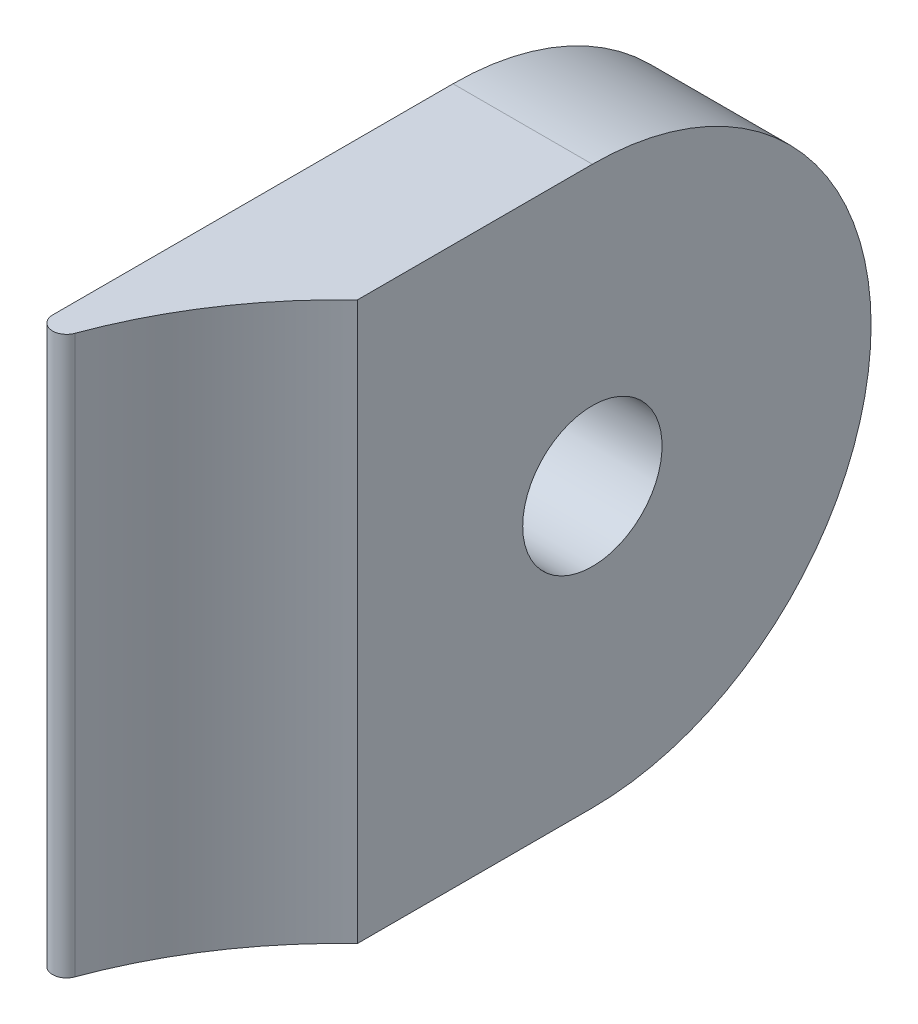
ISO-10303-21;
HEADER;
FILE_DESCRIPTION(('STEP AP214'),'2;1');
FILE_NAME('part.step','',(''),(''),'','','');
FILE_SCHEMA(('AUTOMOTIVE_DESIGN { 1 0 10303 214 1 1 1 1 }'));
ENDSEC;
DATA;
#1=APPLICATION_CONTEXT('core data for automotive mechanical design processes');
#2=APPLICATION_PROTOCOL_DEFINITION('international standard','automotive_design',2000,#1);
#3=PRODUCT_CONTEXT('',#1,'mechanical');
#4=PRODUCT('Part','Part','',(#3));
#5=PRODUCT_RELATED_PRODUCT_CATEGORY('part','',(#4));
#6=PRODUCT_DEFINITION_FORMATION('','',#4);
#7=PRODUCT_DEFINITION_CONTEXT('part definition',#1,'design');
#8=PRODUCT_DEFINITION('design','',#6,#7);
#9=PRODUCT_DEFINITION_SHAPE('','',#8);
#10=(LENGTH_UNIT() NAMED_UNIT(*) SI_UNIT(.MILLI.,.METRE.));
#11=(NAMED_UNIT(*) PLANE_ANGLE_UNIT() SI_UNIT($,.RADIAN.));
#12=(NAMED_UNIT(*) SI_UNIT($,.STERADIAN.) SOLID_ANGLE_UNIT());
#13=UNCERTAINTY_MEASURE_WITH_UNIT(LENGTH_MEASURE(1.E-05),#10,'distance_accuracy_value','');
#14=(GEOMETRIC_REPRESENTATION_CONTEXT(3) GLOBAL_UNCERTAINTY_ASSIGNED_CONTEXT((#13)) GLOBAL_UNIT_ASSIGNED_CONTEXT((#10,
#11,#12)) REPRESENTATION_CONTEXT('',''));
#15=CARTESIAN_POINT('',(0.,0.,0.));
#16=DIRECTION('',(0.,0.,1.));
#17=DIRECTION('',(1.,0.,0.));
#18=AXIS2_PLACEMENT_3D('',#15,#16,#17);
#19=CARTESIAN_POINT('',(0.,20.,0.));
#20=DIRECTION('',(0.,-1.,0.));
#21=DIRECTION('',(0.,0.,-1.));
#22=AXIS2_PLACEMENT_3D('',#19,#20,#21);
#23=CYLINDRICAL_SURFACE('',#22,15.875);
#24=CARTESIAN_POINT('',(0.,20.,0.));
#25=DIRECTION('',(0.,-1.,0.));
#26=DIRECTION('',(0.,0.,1.));
#27=AXIS2_PLACEMENT_3D('',#24,#25,#26);
#28=CIRCLE('',#27,15.875);
#29=CARTESIAN_POINT('',(-14.905534351145,20.,-5.46266150395896));
#30=VERTEX_POINT('',#29);
#31=CARTESIAN_POINT('',(-10.875,20.,-11.5650335062204));
#32=VERTEX_POINT('',#31);
#33=EDGE_CURVE('E89',#30,#32,#28,.T.);
#34=ORIENTED_EDGE('',*,*,#33,.F.);
#35=DIRECTION('',(0.,-1.,0.));
#36=VECTOR('',#35,1.);
#37=CARTESIAN_POINT('',(-14.905534351145,20.,-5.46266150395896));
#38=LINE('',#37,#36);
#39=CARTESIAN_POINT('',(-14.905534351145,0.,-5.46266150395896));
#40=VERTEX_POINT('',#39);
#41=EDGE_CURVE('E129',#30,#40,#38,.T.);
#42=ORIENTED_EDGE('',*,*,#41,.T.);
#43=CARTESIAN_POINT('',(0.,0.,0.));
#44=DIRECTION('',(0.,-1.,0.));
#45=DIRECTION('',(0.,0.,1.));
#46=AXIS2_PLACEMENT_3D('',#43,#44,#45);
#47=CIRCLE('',#46,15.875);
#48=CARTESIAN_POINT('',(-10.875,0.,-11.5650335062204));
#49=VERTEX_POINT('',#48);
#50=EDGE_CURVE('E110',#40,#49,#47,.T.);
#51=ORIENTED_EDGE('',*,*,#50,.T.);
#52=DIRECTION('',(0.,-1.,0.));
#53=VECTOR('',#52,1.);
#54=CARTESIAN_POINT('',(-10.875,20.,-11.5650335062204));
#55=LINE('',#54,#53);
#56=EDGE_CURVE('E105',#32,#49,#55,.T.);
#57=ORIENTED_EDGE('',*,*,#56,.F.);
#58=EDGE_LOOP('',(#34,#42,#51,#57));
#59=FACE_BOUND('',#58,.T.);
#60=ADVANCED_FACE('F36',(#59),#23,.F.);
#61=CARTESIAN_POINT('',(-10.875,20.,-30.));
#62=DIRECTION('',(-1.,0.,0.));
#63=DIRECTION('',(0.,0.,1.));
#64=AXIS2_PLACEMENT_3D('',#61,#62,#63);
#65=PLANE('',#64);
#66=CARTESIAN_POINT('',(-10.875,10.,-20.));
#67=DIRECTION('',(-1.,0.,0.));
#68=DIRECTION('',(0.,0.,1.));
#69=AXIS2_PLACEMENT_3D('',#66,#67,#68);
#70=CIRCLE('',#69,2.5);
#71=CARTESIAN_POINT('',(-10.875,10.,-17.5));
#72=VERTEX_POINT('',#71);
#73=EDGE_CURVE('E133',#72,#72,#70,.T.);
#74=ORIENTED_EDGE('',*,*,#73,.T.);
#75=EDGE_LOOP('',(#74));
#76=FACE_BOUND('',#75,.T.);
#77=DIRECTION('',(0.,0.,-1.));
#78=VECTOR('',#77,1.);
#79=CARTESIAN_POINT('',(-10.875,0.,-30.));
#80=LINE('',#79,#78);
#81=CARTESIAN_POINT('',(-10.875,0.,-20.));
#82=VERTEX_POINT('',#81);
#83=EDGE_CURVE('E137',#49,#82,#80,.T.);
#84=ORIENTED_EDGE('',*,*,#83,.T.);
#85=CARTESIAN_POINT('',(-10.875,10.,-20.));
#86=DIRECTION('',(-1.,0.,0.));
#87=DIRECTION('',(0.,0.,1.));
#88=AXIS2_PLACEMENT_3D('',#85,#86,#87);
#89=CIRCLE('',#88,10.);
#90=CARTESIAN_POINT('',(-10.875,10.,-30.));
#91=VERTEX_POINT('',#90);
#92=EDGE_CURVE('E125',#82,#91,#89,.F.);
#93=ORIENTED_EDGE('',*,*,#92,.T.);
#94=CARTESIAN_POINT('',(-10.875,10.,-20.));
#95=DIRECTION('',(-1.,0.,0.));
#96=DIRECTION('',(0.,0.,1.));
#97=AXIS2_PLACEMENT_3D('',#94,#95,#96);
#98=CIRCLE('',#97,10.);
#99=CARTESIAN_POINT('',(-10.875,20.,-20.));
#100=VERTEX_POINT('',#99);
#101=EDGE_CURVE('E107',#91,#100,#98,.F.);
#102=ORIENTED_EDGE('',*,*,#101,.T.);
#103=DIRECTION('',(0.,0.,-1.));
#104=VECTOR('',#103,1.);
#105=CARTESIAN_POINT('',(-10.875,20.,-30.));
#106=LINE('',#105,#104);
#107=EDGE_CURVE('E92',#32,#100,#106,.T.);
#108=ORIENTED_EDGE('',*,*,#107,.F.);
#109=ORIENTED_EDGE('',*,*,#56,.T.);
#110=EDGE_LOOP('',(#84,#93,#102,#108,#109));
#111=FACE_BOUND('',#110,.T.);
#112=ADVANCED_FACE('F104',(#76,#111),#65,.F.);
#113=CARTESIAN_POINT('',(-15.875,20.,0.));
#114=DIRECTION('',(1.,0.,0.));
#115=DIRECTION('',(0.,0.,-1.));
#116=AXIS2_PLACEMENT_3D('',#113,#114,#115);
#117=PLANE('',#116);
#118=CARTESIAN_POINT('',(-15.875,10.,-20.));
#119=DIRECTION('',(-1.,0.,0.));
#120=DIRECTION('',(0.,0.,1.));
#121=AXIS2_PLACEMENT_3D('',#118,#119,#120);
#122=CIRCLE('',#121,2.5);
#123=CARTESIAN_POINT('',(-15.875,10.,-17.5));
#124=VERTEX_POINT('',#123);
#125=EDGE_CURVE('E140',#124,#124,#122,.T.);
#126=ORIENTED_EDGE('',*,*,#125,.F.);
#127=EDGE_LOOP('',(#126));
#128=FACE_BOUND('',#127,.T.);
#129=DIRECTION('',(0.,0.,1.));
#130=VECTOR('',#129,1.);
#131=CARTESIAN_POINT('',(-15.875,0.,0.));
#132=LINE('',#131,#130);
#133=CARTESIAN_POINT('',(-15.875,0.,-20.));
#134=VERTEX_POINT('',#133);
#135=CARTESIAN_POINT('',(-15.875,0.,-5.63471383479232));
#136=VERTEX_POINT('',#135);
#137=EDGE_CURVE('E99',#134,#136,#132,.T.);
#138=ORIENTED_EDGE('',*,*,#137,.T.);
#139=DIRECTION('',(0.,-1.,0.));
#140=VECTOR('',#139,1.);
#141=CARTESIAN_POINT('',(-15.875,20.,-5.63471383479232));
#142=LINE('',#141,#140);
#143=CARTESIAN_POINT('',(-15.875,20.,-5.63471383479232));
#144=VERTEX_POINT('',#143);
#145=EDGE_CURVE('E44',#136,#144,#142,.F.);
#146=ORIENTED_EDGE('',*,*,#145,.T.);
#147=DIRECTION('',(0.,0.,1.));
#148=VECTOR('',#147,1.);
#149=CARTESIAN_POINT('',(-15.875,20.,0.));
#150=LINE('',#149,#148);
#151=CARTESIAN_POINT('',(-15.875,20.,-20.));
#152=VERTEX_POINT('',#151);
#153=EDGE_CURVE('E108',#152,#144,#150,.T.);
#154=ORIENTED_EDGE('',*,*,#153,.F.);
#155=CARTESIAN_POINT('',(-15.875,10.,-20.));
#156=DIRECTION('',(1.,0.,0.));
#157=DIRECTION('',(0.,0.,-1.));
#158=AXIS2_PLACEMENT_3D('',#155,#156,#157);
#159=CIRCLE('',#158,10.);
#160=CARTESIAN_POINT('',(-15.875,10.,-30.));
#161=VERTEX_POINT('',#160);
#162=EDGE_CURVE('E112',#152,#161,#159,.F.);
#163=ORIENTED_EDGE('',*,*,#162,.T.);
#164=CARTESIAN_POINT('',(-15.875,10.,-20.));
#165=DIRECTION('',(1.,0.,0.));
#166=DIRECTION('',(0.,0.,-1.));
#167=AXIS2_PLACEMENT_3D('',#164,#165,#166);
#168=CIRCLE('',#167,10.);
#169=EDGE_CURVE('E114',#161,#134,#168,.F.);
#170=ORIENTED_EDGE('',*,*,#169,.T.);
#171=EDGE_LOOP('',(#138,#146,#154,#163,#170));
#172=FACE_BOUND('',#171,.T.);
#173=ADVANCED_FACE('F154',(#128,#172),#117,.F.);
#174=CARTESIAN_POINT('',(0.,20.,0.));
#175=DIRECTION('',(0.,1.,0.));
#176=DIRECTION('',(0.,0.,1.));
#177=AXIS2_PLACEMENT_3D('',#174,#175,#176);
#178=PLANE('',#177);
#179=ORIENTED_EDGE('',*,*,#153,.T.);
#180=CARTESIAN_POINT('',(-15.375,20.,-5.63471383479232));
#181=DIRECTION('',(0.,1.,0.));
#182=DIRECTION('',(0.,0.,1.));
#183=AXIS2_PLACEMENT_3D('',#180,#181,#182);
#184=CIRCLE('',#183,0.5);
#185=EDGE_CURVE('E11',#144,#30,#184,.T.);
#186=ORIENTED_EDGE('',*,*,#185,.T.);
#187=ORIENTED_EDGE('',*,*,#33,.T.);
#188=ORIENTED_EDGE('',*,*,#107,.T.);
#189=DIRECTION('',(-1.,0.,0.));
#190=VECTOR('',#189,1.);
#191=CARTESIAN_POINT('',(-15.875,20.,-20.));
#192=LINE('',#191,#190);
#193=EDGE_CURVE('E127',#100,#152,#192,.T.);
#194=ORIENTED_EDGE('',*,*,#193,.T.);
#195=EDGE_LOOP('',(#179,#186,#187,#188,#194));
#196=FACE_BOUND('',#195,.T.);
#197=ADVANCED_FACE('F91',(#196),#178,.T.);
#198=CARTESIAN_POINT('',(0.,0.,0.));
#199=DIRECTION('',(0.,1.,0.));
#200=DIRECTION('',(0.,0.,1.));
#201=AXIS2_PLACEMENT_3D('',#198,#199,#200);
#202=PLANE('',#201);
#203=ORIENTED_EDGE('',*,*,#50,.F.);
#204=CARTESIAN_POINT('',(-15.375,0.,-5.63471383479232));
#205=DIRECTION('',(0.,1.,0.));
#206=DIRECTION('',(0.,0.,1.));
#207=AXIS2_PLACEMENT_3D('',#204,#205,#206);
#208=CIRCLE('',#207,0.5);
#209=EDGE_CURVE('E58',#40,#136,#208,.F.);
#210=ORIENTED_EDGE('',*,*,#209,.T.);
#211=ORIENTED_EDGE('',*,*,#137,.F.);
#212=DIRECTION('',(-1.,0.,0.));
#213=VECTOR('',#212,1.);
#214=CARTESIAN_POINT('',(0.,0.,-20.));
#215=LINE('',#214,#213);
#216=EDGE_CURVE('E121',#134,#82,#215,.F.);
#217=ORIENTED_EDGE('',*,*,#216,.T.);
#218=ORIENTED_EDGE('',*,*,#83,.F.);
#219=EDGE_LOOP('',(#203,#210,#211,#217,#218));
#220=FACE_BOUND('',#219,.T.);
#221=ADVANCED_FACE('F136',(#220),#202,.F.);
#222=CARTESIAN_POINT('',(0.,10.,-20.));
#223=DIRECTION('',(1.,0.,0.));
#224=DIRECTION('',(0.,0.,-1.));
#225=AXIS2_PLACEMENT_3D('',#222,#223,#224);
#226=CYLINDRICAL_SURFACE('',#225,10.);
#227=ORIENTED_EDGE('',*,*,#193,.F.);
#228=ORIENTED_EDGE('',*,*,#101,.F.);
#229=DIRECTION('',(-1.,0.,0.));
#230=VECTOR('',#229,1.);
#231=CARTESIAN_POINT('',(-10.875,10.,-30.));
#232=LINE('',#231,#230);
#233=EDGE_CURVE('E130',#161,#91,#232,.F.);
#234=ORIENTED_EDGE('',*,*,#233,.F.);
#235=ORIENTED_EDGE('',*,*,#162,.F.);
#236=EDGE_LOOP('',(#227,#228,#234,#235));
#237=FACE_BOUND('',#236,.T.);
#238=ADVANCED_FACE('F170',(#237),#226,.T.);
#239=CARTESIAN_POINT('',(-15.875,10.,-20.));
#240=DIRECTION('',(-1.,0.,0.));
#241=DIRECTION('',(0.,0.,1.));
#242=AXIS2_PLACEMENT_3D('',#239,#240,#241);
#243=CYLINDRICAL_SURFACE('',#242,10.);
#244=ORIENTED_EDGE('',*,*,#92,.F.);
#245=ORIENTED_EDGE('',*,*,#216,.F.);
#246=ORIENTED_EDGE('',*,*,#169,.F.);
#247=ORIENTED_EDGE('',*,*,#233,.T.);
#248=EDGE_LOOP('',(#244,#245,#246,#247));
#249=FACE_BOUND('',#248,.T.);
#250=ADVANCED_FACE('F150',(#249),#243,.T.);
#251=CARTESIAN_POINT('',(-10.875,10.,-20.));
#252=DIRECTION('',(-1.,0.,0.));
#253=DIRECTION('',(0.,0.,1.));
#254=AXIS2_PLACEMENT_3D('',#251,#252,#253);
#255=CYLINDRICAL_SURFACE('',#254,2.5);
#256=CARTESIAN_POINT('',(-10.875,10.,-17.5));
#257=CARTESIAN_POINT('',(-10.9270833333333,10.,-17.5));
#258=CARTESIAN_POINT('',(-10.9791666666667,10.,-17.5));
#259=CARTESIAN_POINT('',(-11.0833333333333,10.,-17.5));
#260=CARTESIAN_POINT('',(-11.1354166666667,10.,-17.5));
#261=CARTESIAN_POINT('',(-11.2395833333333,10.,-17.5));
#262=CARTESIAN_POINT('',(-11.2916666666667,10.,-17.5));
#263=CARTESIAN_POINT('',(-11.3958333333333,10.,-17.5));
#264=CARTESIAN_POINT('',(-11.4479166666667,10.,-17.5));
#265=CARTESIAN_POINT('',(-11.5520833333333,10.,-17.5));
#266=CARTESIAN_POINT('',(-11.6041666666667,10.,-17.5));
#267=CARTESIAN_POINT('',(-11.7083333333333,10.,-17.5));
#268=CARTESIAN_POINT('',(-11.7604166666667,10.,-17.5));
#269=CARTESIAN_POINT('',(-11.8645833333333,10.,-17.5));
#270=CARTESIAN_POINT('',(-11.9166666666667,10.,-17.5));
#271=CARTESIAN_POINT('',(-12.0208333333333,10.,-17.5));
#272=CARTESIAN_POINT('',(-12.0729166666667,10.,-17.5));
#273=CARTESIAN_POINT('',(-12.1770833333333,10.,-17.5));
#274=CARTESIAN_POINT('',(-12.2291666666667,10.,-17.5));
#275=CARTESIAN_POINT('',(-12.3333333333333,10.,-17.5));
#276=CARTESIAN_POINT('',(-12.3854166666667,10.,-17.5));
#277=CARTESIAN_POINT('',(-12.4895833333333,10.,-17.5));
#278=CARTESIAN_POINT('',(-12.5416666666667,10.,-17.5));
#279=CARTESIAN_POINT('',(-12.6458333333333,10.,-17.5));
#280=CARTESIAN_POINT('',(-12.6979166666667,10.,-17.5));
#281=CARTESIAN_POINT('',(-12.8020833333333,10.,-17.5));
#282=CARTESIAN_POINT('',(-12.8541666666667,10.,-17.5));
#283=CARTESIAN_POINT('',(-12.9583333333333,10.,-17.5));
#284=CARTESIAN_POINT('',(-13.0104166666667,10.,-17.5));
#285=CARTESIAN_POINT('',(-13.1145833333333,10.,-17.5));
#286=CARTESIAN_POINT('',(-13.1666666666667,10.,-17.5));
#287=CARTESIAN_POINT('',(-13.2708333333333,10.,-17.5));
#288=CARTESIAN_POINT('',(-13.3229166666667,10.,-17.5));
#289=CARTESIAN_POINT('',(-13.4270833333333,10.,-17.5));
#290=CARTESIAN_POINT('',(-13.4791666666667,10.,-17.5));
#291=CARTESIAN_POINT('',(-13.5833333333333,10.,-17.5));
#292=CARTESIAN_POINT('',(-13.6354166666667,10.,-17.5));
#293=CARTESIAN_POINT('',(-13.7395833333333,10.,-17.5));
#294=CARTESIAN_POINT('',(-13.7916666666667,10.,-17.5));
#295=CARTESIAN_POINT('',(-13.8958333333333,10.,-17.5));
#296=CARTESIAN_POINT('',(-13.9479166666667,10.,-17.5));
#297=CARTESIAN_POINT('',(-14.0520833333333,10.,-17.5));
#298=CARTESIAN_POINT('',(-14.1041666666667,10.,-17.5));
#299=CARTESIAN_POINT('',(-14.2083333333333,10.,-17.5));
#300=CARTESIAN_POINT('',(-14.2604166666667,10.,-17.5));
#301=CARTESIAN_POINT('',(-14.3645833333333,10.,-17.5));
#302=CARTESIAN_POINT('',(-14.4166666666667,10.,-17.5));
#303=CARTESIAN_POINT('',(-14.5208333333333,10.,-17.5));
#304=CARTESIAN_POINT('',(-14.5729166666667,10.,-17.5));
#305=CARTESIAN_POINT('',(-14.6770833333333,10.,-17.5));
#306=CARTESIAN_POINT('',(-14.7291666666667,10.,-17.5));
#307=CARTESIAN_POINT('',(-14.8333333333333,10.,-17.5));
#308=CARTESIAN_POINT('',(-14.8854166666667,10.,-17.5));
#309=CARTESIAN_POINT('',(-14.9895833333333,10.,-17.5));
#310=CARTESIAN_POINT('',(-15.0416666666667,10.,-17.5));
#311=CARTESIAN_POINT('',(-15.1458333333333,10.,-17.5));
#312=CARTESIAN_POINT('',(-15.1979166666667,10.,-17.5));
#313=CARTESIAN_POINT('',(-15.3020833333333,10.,-17.5));
#314=CARTESIAN_POINT('',(-15.3541666666667,10.,-17.5));
#315=CARTESIAN_POINT('',(-15.4583333333333,10.,-17.5));
#316=CARTESIAN_POINT('',(-15.5104166666667,10.,-17.5));
#317=CARTESIAN_POINT('',(-15.6145833333333,10.,-17.5));
#318=CARTESIAN_POINT('',(-15.6666666666667,10.,-17.5));
#319=CARTESIAN_POINT('',(-15.7708333333333,10.,-17.5));
#320=CARTESIAN_POINT('',(-15.8229166666667,10.,-17.5));
#321=CARTESIAN_POINT('',(-15.875,10.,-17.5));
#322=B_SPLINE_CURVE_WITH_KNOTS('',3,(#256,#257,#258,#259,#260,#261,#262,#263,#264,#265,#266,
#267,#268,#269,#270,#271,#272,#273,#274,#275,#276,#277,#278,#279,#280,#281,#282,#283,#284,#285,
#286,#287,#288,#289,#290,#291,#292,#293,#294,#295,#296,#297,#298,#299,#300,#301,#302,#303,#304,
#305,#306,#307,#308,#309,#310,#311,#312,#313,#314,#315,#316,#317,#318,#319,#320,#321),
.UNSPECIFIED.,.F.,.F.,(4,2,2,2,2,2,2,2,2,2,2,2,2,2,2,2,2,2,2,2,2,2,2,2,2,2,2,2,2,2,2,2,4),(0.,
0.15625,0.3125,0.46875,0.625000000000001,0.781250000000001,0.937500000000001,1.09375,1.25,
1.40625,1.5625,1.71875,1.875,2.03125,2.1875,2.34375,2.5,2.65625,2.8125,2.96875,3.12500000000001,
3.28125000000001,3.43750000000001,3.59375000000001,3.75000000000001,3.90625000000001,
4.06250000000001,4.21875000000001,4.37500000000001,4.53125000000001,4.68750000000001,
4.84375000000001,5.00000000000001),.UNSPECIFIED.);
#323=EDGE_CURVE('BSEAM147',#72,#124,#322,.T.);
#324=ORIENTED_EDGE('',*,*,#73,.F.);
#325=ORIENTED_EDGE('',*,*,#125,.T.);
#326=ORIENTED_EDGE('',*,*,#323,.T.);
#327=ORIENTED_EDGE('',*,*,#323,.F.);
#328=EDGE_LOOP('',(#324,#326,#325,#327));
#329=FACE_BOUND('',#328,.T.);
#330=ADVANCED_FACE('F147',(#329),#255,.F.);
#331=CARTESIAN_POINT('',(-15.375,20.,-5.63471383479232));
#332=DIRECTION('',(0.,-1.,0.));
#333=DIRECTION('',(0.,0.,-1.));
#334=AXIS2_PLACEMENT_3D('',#331,#332,#333);
#335=CYLINDRICAL_SURFACE('',#334,0.5);
#336=ORIENTED_EDGE('',*,*,#185,.F.);
#337=ORIENTED_EDGE('',*,*,#145,.F.);
#338=ORIENTED_EDGE('',*,*,#209,.F.);
#339=ORIENTED_EDGE('',*,*,#41,.F.);
#340=EDGE_LOOP('',(#336,#337,#338,#339));
#341=FACE_BOUND('',#340,.T.);
#342=ADVANCED_FACE('F38',(#341),#335,.T.);
#343=CLOSED_SHELL('',(#60,#112,#173,#197,#221,#238,#250,#330,#342));
#344=MANIFOLD_SOLID_BREP('B2',#343);
#345=ADVANCED_BREP_SHAPE_REPRESENTATION('',(#18,#344),#14);
#346=SHAPE_DEFINITION_REPRESENTATION(#9,#345);
ENDSEC;
END-ISO-10303-21;
